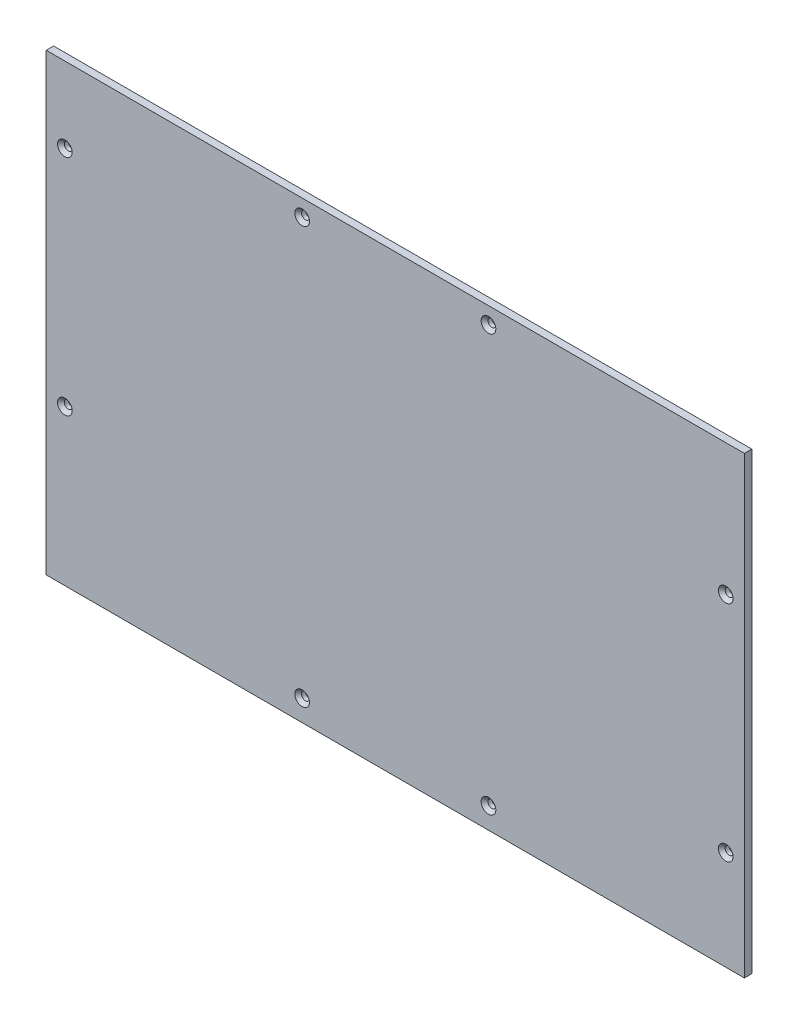
ISO-10303-21;
HEADER;
FILE_DESCRIPTION(('STEP AP214'),'2;1');
FILE_NAME('part.step','',(''),(''),'','','');
FILE_SCHEMA(('AUTOMOTIVE_DESIGN { 1 0 10303 214 1 1 1 1 }'));
ENDSEC;
DATA;
#1=APPLICATION_CONTEXT('core data for automotive mechanical design processes');
#2=APPLICATION_PROTOCOL_DEFINITION('international standard','automotive_design',2000,#1);
#3=PRODUCT_CONTEXT('',#1,'mechanical');
#4=PRODUCT('Part','Part','',(#3));
#5=PRODUCT_RELATED_PRODUCT_CATEGORY('part','',(#4));
#6=PRODUCT_DEFINITION_FORMATION('','',#4);
#7=PRODUCT_DEFINITION_CONTEXT('part definition',#1,'design');
#8=PRODUCT_DEFINITION('design','',#6,#7);
#9=PRODUCT_DEFINITION_SHAPE('','',#8);
#10=(LENGTH_UNIT() NAMED_UNIT(*) SI_UNIT(.MILLI.,.METRE.));
#11=(NAMED_UNIT(*) PLANE_ANGLE_UNIT() SI_UNIT($,.RADIAN.));
#12=(NAMED_UNIT(*) SI_UNIT($,.STERADIAN.) SOLID_ANGLE_UNIT());
#13=UNCERTAINTY_MEASURE_WITH_UNIT(LENGTH_MEASURE(1.E-05),#10,'distance_accuracy_value','');
#14=(GEOMETRIC_REPRESENTATION_CONTEXT(3) GLOBAL_UNCERTAINTY_ASSIGNED_CONTEXT((#13)) GLOBAL_UNIT_ASSIGNED_CONTEXT((#10,
#11,#12)) REPRESENTATION_CONTEXT('',''));
#15=CARTESIAN_POINT('',(0.,0.,0.));
#16=DIRECTION('',(0.,0.,1.));
#17=DIRECTION('',(1.,0.,0.));
#18=AXIS2_PLACEMENT_3D('',#15,#16,#17);
#19=CARTESIAN_POINT('',(-149.85,0.,3.175));
#20=DIRECTION('',(1.,0.,0.));
#21=DIRECTION('',(0.,1.,0.));
#22=AXIS2_PLACEMENT_3D('',#19,#20,#21);
#23=PLANE('',#22);
#24=DIRECTION('',(0.,-1.,0.));
#25=VECTOR('',#24,1.);
#26=CARTESIAN_POINT('',(-149.85,0.,0.));
#27=LINE('',#26,#25);
#28=CARTESIAN_POINT('',(-149.85,97.521875,0.));
#29=VERTEX_POINT('',#28);
#30=CARTESIAN_POINT('',(-149.85,-97.521875,0.));
#31=VERTEX_POINT('',#30);
#32=EDGE_CURVE('E106',#29,#31,#27,.T.);
#33=ORIENTED_EDGE('',*,*,#32,.T.);
#34=DIRECTION('',(0.,0.,-1.));
#35=VECTOR('',#34,1.);
#36=CARTESIAN_POINT('',(-149.85,-97.521875,3.175));
#37=LINE('',#36,#35);
#38=CARTESIAN_POINT('',(-149.85,-97.521875,3.175));
#39=VERTEX_POINT('',#38);
#40=EDGE_CURVE('E11',#39,#31,#37,.T.);
#41=ORIENTED_EDGE('',*,*,#40,.F.);
#42=DIRECTION('',(0.,-1.,0.));
#43=VECTOR('',#42,1.);
#44=CARTESIAN_POINT('',(-149.85,0.,3.175));
#45=LINE('',#44,#43);
#46=CARTESIAN_POINT('',(-149.85,97.521875,3.175));
#47=VERTEX_POINT('',#46);
#48=EDGE_CURVE('E92',#47,#39,#45,.T.);
#49=ORIENTED_EDGE('',*,*,#48,.F.);
#50=DIRECTION('',(0.,0.,-1.));
#51=VECTOR('',#50,1.);
#52=CARTESIAN_POINT('',(-149.85,97.521875,3.175));
#53=LINE('',#52,#51);
#54=EDGE_CURVE('E59',#47,#29,#53,.T.);
#55=ORIENTED_EDGE('',*,*,#54,.T.);
#56=EDGE_LOOP('',(#33,#41,#49,#55));
#57=FACE_BOUND('',#56,.T.);
#58=ADVANCED_FACE('F43',(#57),#23,.F.);
#59=CARTESIAN_POINT('',(0.,-97.521875,3.175));
#60=DIRECTION('',(0.,1.,0.));
#61=DIRECTION('',(0.,0.,1.));
#62=AXIS2_PLACEMENT_3D('',#59,#60,#61);
#63=PLANE('',#62);
#64=DIRECTION('',(1.,0.,0.));
#65=VECTOR('',#64,1.);
#66=CARTESIAN_POINT('',(0.,-97.521875,0.));
#67=LINE('',#66,#65);
#68=CARTESIAN_POINT('',(149.85,-97.521875,0.));
#69=VERTEX_POINT('',#68);
#70=EDGE_CURVE('E97',#31,#69,#67,.T.);
#71=ORIENTED_EDGE('',*,*,#70,.T.);
#72=DIRECTION('',(0.,0.,-1.));
#73=VECTOR('',#72,1.);
#74=CARTESIAN_POINT('',(149.85,-97.521875,3.175));
#75=LINE('',#74,#73);
#76=CARTESIAN_POINT('',(149.85,-97.521875,3.175));
#77=VERTEX_POINT('',#76);
#78=EDGE_CURVE('E51',#77,#69,#75,.T.);
#79=ORIENTED_EDGE('',*,*,#78,.F.);
#80=DIRECTION('',(1.,0.,0.));
#81=VECTOR('',#80,1.);
#82=CARTESIAN_POINT('',(0.,-97.521875,3.175));
#83=LINE('',#82,#81);
#84=EDGE_CURVE('E84',#39,#77,#83,.T.);
#85=ORIENTED_EDGE('',*,*,#84,.F.);
#86=ORIENTED_EDGE('',*,*,#40,.T.);
#87=EDGE_LOOP('',(#71,#79,#85,#86));
#88=FACE_BOUND('',#87,.T.);
#89=ADVANCED_FACE('F96',(#88),#63,.F.);
#90=CARTESIAN_POINT('',(149.85,0.,3.175));
#91=DIRECTION('',(1.,0.,0.));
#92=DIRECTION('',(0.,1.,0.));
#93=AXIS2_PLACEMENT_3D('',#90,#91,#92);
#94=PLANE('',#93);
#95=DIRECTION('',(0.,-1.,0.));
#96=VECTOR('',#95,1.);
#97=CARTESIAN_POINT('',(149.85,0.,0.));
#98=LINE('',#97,#96);
#99=CARTESIAN_POINT('',(149.85,97.521875,0.));
#100=VERTEX_POINT('',#99);
#101=EDGE_CURVE('E110',#100,#69,#98,.T.);
#102=ORIENTED_EDGE('',*,*,#101,.F.);
#103=DIRECTION('',(0.,0.,-1.));
#104=VECTOR('',#103,1.);
#105=CARTESIAN_POINT('',(149.85,97.521875,3.175));
#106=LINE('',#105,#104);
#107=CARTESIAN_POINT('',(149.85,97.521875,3.175));
#108=VERTEX_POINT('',#107);
#109=EDGE_CURVE('E73',#108,#100,#106,.T.);
#110=ORIENTED_EDGE('',*,*,#109,.F.);
#111=DIRECTION('',(0.,-1.,0.));
#112=VECTOR('',#111,1.);
#113=CARTESIAN_POINT('',(149.85,0.,3.175));
#114=LINE('',#113,#112);
#115=EDGE_CURVE('E91',#108,#77,#114,.T.);
#116=ORIENTED_EDGE('',*,*,#115,.T.);
#117=ORIENTED_EDGE('',*,*,#78,.T.);
#118=EDGE_LOOP('',(#102,#110,#116,#117));
#119=FACE_BOUND('',#118,.T.);
#120=ADVANCED_FACE('F100',(#119),#94,.T.);
#121=CARTESIAN_POINT('',(0.,97.521875,3.175));
#122=DIRECTION('',(0.,1.,0.));
#123=DIRECTION('',(0.,0.,1.));
#124=AXIS2_PLACEMENT_3D('',#121,#122,#123);
#125=PLANE('',#124);
#126=DIRECTION('',(1.,0.,0.));
#127=VECTOR('',#126,1.);
#128=CARTESIAN_POINT('',(0.,97.521875,0.));
#129=LINE('',#128,#127);
#130=EDGE_CURVE('E112',#29,#100,#129,.T.);
#131=ORIENTED_EDGE('',*,*,#130,.F.);
#132=ORIENTED_EDGE('',*,*,#54,.F.);
#133=DIRECTION('',(1.,0.,0.));
#134=VECTOR('',#133,1.);
#135=CARTESIAN_POINT('',(0.,97.521875,3.175));
#136=LINE('',#135,#134);
#137=EDGE_CURVE('E101',#47,#108,#136,.T.);
#138=ORIENTED_EDGE('',*,*,#137,.T.);
#139=ORIENTED_EDGE('',*,*,#109,.T.);
#140=EDGE_LOOP('',(#131,#132,#138,#139));
#141=FACE_BOUND('',#140,.T.);
#142=ADVANCED_FACE('F195',(#141),#125,.T.);
#143=CARTESIAN_POINT('',(0.,0.,3.175));
#144=DIRECTION('',(0.,0.,1.));
#145=DIRECTION('',(1.,0.,0.));
#146=AXIS2_PLACEMENT_3D('',#143,#144,#145);
#147=PLANE('',#146);
#148=CARTESIAN_POINT('',(-40.0000000000012,90.3781250520014,3.175));
#149=DIRECTION('',(0.,0.,1.));
#150=DIRECTION('',(1.,0.,0.));
#151=AXIS2_PLACEMENT_3D('',#148,#149,#150);
#152=CIRCLE('',#151,3.15);
#153=CARTESIAN_POINT('',(-36.8500000000012,90.3781250520014,3.175));
#154=VERTEX_POINT('',#153);
#155=EDGE_CURVE('E186',#154,#154,#152,.T.);
#156=ORIENTED_EDGE('',*,*,#155,.F.);
#157=EDGE_LOOP('',(#156));
#158=FACE_BOUND('',#157,.T.);
#159=CARTESIAN_POINT('',(40.0000000000012,90.3781250520013,3.175));
#160=DIRECTION('',(0.,0.,1.));
#161=DIRECTION('',(1.,0.,0.));
#162=AXIS2_PLACEMENT_3D('',#159,#160,#161);
#163=CIRCLE('',#162,3.15);
#164=CARTESIAN_POINT('',(43.1500000000012,90.3781250520013,3.175));
#165=VERTEX_POINT('',#164);
#166=EDGE_CURVE('E177',#165,#165,#163,.T.);
#167=ORIENTED_EDGE('',*,*,#166,.F.);
#168=EDGE_LOOP('',(#167));
#169=FACE_BOUND('',#168,.T.);
#170=CARTESIAN_POINT('',(141.850000066001,41.078125052,3.175));
#171=DIRECTION('',(0.,0.,1.));
#172=DIRECTION('',(1.,0.,0.));
#173=AXIS2_PLACEMENT_3D('',#170,#171,#172);
#174=CIRCLE('',#173,3.15000000000001);
#175=CARTESIAN_POINT('',(145.000000066001,41.078125052,3.175));
#176=VERTEX_POINT('',#175);
#177=EDGE_CURVE('E168',#176,#176,#174,.T.);
#178=ORIENTED_EDGE('',*,*,#177,.F.);
#179=EDGE_LOOP('',(#178));
#180=FACE_BOUND('',#179,.T.);
#181=CARTESIAN_POINT('',(141.850000066,-54.921874948,3.175));
#182=DIRECTION('',(0.,0.,1.));
#183=DIRECTION('',(1.,0.,0.));
#184=AXIS2_PLACEMENT_3D('',#181,#182,#183);
#185=CIRCLE('',#184,3.15000000000001);
#186=CARTESIAN_POINT('',(145.000000066,-54.921874948,3.175));
#187=VERTEX_POINT('',#186);
#188=EDGE_CURVE('E159',#187,#187,#185,.T.);
#189=ORIENTED_EDGE('',*,*,#188,.F.);
#190=EDGE_LOOP('',(#189));
#191=FACE_BOUND('',#190,.T.);
#192=CARTESIAN_POINT('',(40.0000000000011,-88.4276249479999,3.175));
#193=DIRECTION('',(0.,0.,1.));
#194=DIRECTION('',(1.,0.,0.));
#195=AXIS2_PLACEMENT_3D('',#192,#193,#194);
#196=CIRCLE('',#195,3.15);
#197=CARTESIAN_POINT('',(43.1500000000011,-88.4276249479999,3.175));
#198=VERTEX_POINT('',#197);
#199=EDGE_CURVE('E150',#198,#198,#196,.T.);
#200=ORIENTED_EDGE('',*,*,#199,.F.);
#201=EDGE_LOOP('',(#200));
#202=FACE_BOUND('',#201,.T.);
#203=CARTESIAN_POINT('',(-40.0000000000013,-88.4276249479999,3.175));
#204=DIRECTION('',(0.,0.,1.));
#205=DIRECTION('',(1.,0.,0.));
#206=AXIS2_PLACEMENT_3D('',#203,#204,#205);
#207=CIRCLE('',#206,3.15);
#208=CARTESIAN_POINT('',(-36.8500000000013,-88.4276249479999,3.175));
#209=VERTEX_POINT('',#208);
#210=EDGE_CURVE('E141',#209,#209,#207,.T.);
#211=ORIENTED_EDGE('',*,*,#210,.F.);
#212=EDGE_LOOP('',(#211));
#213=FACE_BOUND('',#212,.T.);
#214=CARTESIAN_POINT('',(-141.850000066,-30.9218749479998,3.175));
#215=DIRECTION('',(0.,0.,1.));
#216=DIRECTION('',(1.,0.,0.));
#217=AXIS2_PLACEMENT_3D('',#214,#215,#216);
#218=CIRCLE('',#217,3.14999999999999);
#219=CARTESIAN_POINT('',(-138.700000066,-30.9218749479998,3.175));
#220=VERTEX_POINT('',#219);
#221=EDGE_CURVE('E132',#220,#220,#218,.T.);
#222=ORIENTED_EDGE('',*,*,#221,.F.);
#223=EDGE_LOOP('',(#222));
#224=FACE_BOUND('',#223,.T.);
#225=CARTESIAN_POINT('',(-141.850000066,65.0781250520002,3.175));
#226=DIRECTION('',(0.,0.,1.));
#227=DIRECTION('',(1.,0.,0.));
#228=AXIS2_PLACEMENT_3D('',#225,#226,#227);
#229=CIRCLE('',#228,3.14999999999999);
#230=CARTESIAN_POINT('',(-138.700000066,65.0781250520002,3.175));
#231=VERTEX_POINT('',#230);
#232=EDGE_CURVE('E123',#231,#231,#229,.T.);
#233=ORIENTED_EDGE('',*,*,#232,.F.);
#234=EDGE_LOOP('',(#233));
#235=FACE_BOUND('',#234,.T.);
#236=ORIENTED_EDGE('',*,*,#48,.T.);
#237=ORIENTED_EDGE('',*,*,#84,.T.);
#238=ORIENTED_EDGE('',*,*,#115,.F.);
#239=ORIENTED_EDGE('',*,*,#137,.F.);
#240=EDGE_LOOP('',(#236,#237,#238,#239));
#241=FACE_BOUND('',#240,.T.);
#242=ADVANCED_FACE('F88',(#158,#169,#180,#191,#202,#213,#224,#235,#241),#147,.T.);
#243=CARTESIAN_POINT('',(0.,0.,0.));
#244=DIRECTION('',(0.,0.,1.));
#245=DIRECTION('',(1.,0.,0.));
#246=AXIS2_PLACEMENT_3D('',#243,#244,#245);
#247=PLANE('',#246);
#248=CARTESIAN_POINT('',(-40.0000000000012,90.3781250520014,0.));
#249=DIRECTION('',(0.,0.,1.));
#250=DIRECTION('',(1.,0.,0.));
#251=AXIS2_PLACEMENT_3D('',#248,#249,#250);
#252=CIRCLE('',#251,1.69999999999999);
#253=CARTESIAN_POINT('',(-38.3000000000012,90.3781250520014,0.));
#254=VERTEX_POINT('',#253);
#255=EDGE_CURVE('E180',#254,#254,#252,.T.);
#256=ORIENTED_EDGE('',*,*,#255,.T.);
#257=EDGE_LOOP('',(#256));
#258=FACE_BOUND('',#257,.T.);
#259=CARTESIAN_POINT('',(40.0000000000012,90.3781250520013,0.));
#260=DIRECTION('',(0.,0.,1.));
#261=DIRECTION('',(1.,0.,0.));
#262=AXIS2_PLACEMENT_3D('',#259,#260,#261);
#263=CIRCLE('',#262,1.69999999999999);
#264=CARTESIAN_POINT('',(41.7000000000012,90.3781250520013,0.));
#265=VERTEX_POINT('',#264);
#266=EDGE_CURVE('E171',#265,#265,#263,.T.);
#267=ORIENTED_EDGE('',*,*,#266,.T.);
#268=EDGE_LOOP('',(#267));
#269=FACE_BOUND('',#268,.T.);
#270=CARTESIAN_POINT('',(141.850000066001,41.078125052,0.));
#271=DIRECTION('',(0.,0.,1.));
#272=DIRECTION('',(1.,0.,0.));
#273=AXIS2_PLACEMENT_3D('',#270,#271,#272);
#274=CIRCLE('',#273,1.69999999999998);
#275=CARTESIAN_POINT('',(143.550000066001,41.078125052,0.));
#276=VERTEX_POINT('',#275);
#277=EDGE_CURVE('E162',#276,#276,#274,.T.);
#278=ORIENTED_EDGE('',*,*,#277,.T.);
#279=EDGE_LOOP('',(#278));
#280=FACE_BOUND('',#279,.T.);
#281=CARTESIAN_POINT('',(141.850000066,-54.921874948,0.));
#282=DIRECTION('',(0.,0.,1.));
#283=DIRECTION('',(1.,0.,0.));
#284=AXIS2_PLACEMENT_3D('',#281,#282,#283);
#285=CIRCLE('',#284,1.69999999999998);
#286=CARTESIAN_POINT('',(143.550000066,-54.921874948,0.));
#287=VERTEX_POINT('',#286);
#288=EDGE_CURVE('E153',#287,#287,#285,.T.);
#289=ORIENTED_EDGE('',*,*,#288,.T.);
#290=EDGE_LOOP('',(#289));
#291=FACE_BOUND('',#290,.T.);
#292=CARTESIAN_POINT('',(40.0000000000011,-88.4276249479999,0.));
#293=DIRECTION('',(0.,0.,1.));
#294=DIRECTION('',(1.,0.,0.));
#295=AXIS2_PLACEMENT_3D('',#292,#293,#294);
#296=CIRCLE('',#295,1.69999999999999);
#297=CARTESIAN_POINT('',(41.7000000000011,-88.4276249479999,0.));
#298=VERTEX_POINT('',#297);
#299=EDGE_CURVE('E144',#298,#298,#296,.T.);
#300=ORIENTED_EDGE('',*,*,#299,.T.);
#301=EDGE_LOOP('',(#300));
#302=FACE_BOUND('',#301,.T.);
#303=CARTESIAN_POINT('',(-40.0000000000013,-88.4276249479999,0.));
#304=DIRECTION('',(0.,0.,1.));
#305=DIRECTION('',(1.,0.,0.));
#306=AXIS2_PLACEMENT_3D('',#303,#304,#305);
#307=CIRCLE('',#306,1.69999999999999);
#308=CARTESIAN_POINT('',(-38.3000000000013,-88.4276249479999,0.));
#309=VERTEX_POINT('',#308);
#310=EDGE_CURVE('E135',#309,#309,#307,.T.);
#311=ORIENTED_EDGE('',*,*,#310,.T.);
#312=EDGE_LOOP('',(#311));
#313=FACE_BOUND('',#312,.T.);
#314=CARTESIAN_POINT('',(-141.850000066,-30.9218749479998,0.));
#315=DIRECTION('',(0.,0.,1.));
#316=DIRECTION('',(1.,0.,0.));
#317=AXIS2_PLACEMENT_3D('',#314,#315,#316);
#318=CIRCLE('',#317,1.69999999999998);
#319=CARTESIAN_POINT('',(-140.150000066,-30.9218749479998,0.));
#320=VERTEX_POINT('',#319);
#321=EDGE_CURVE('E126',#320,#320,#318,.T.);
#322=ORIENTED_EDGE('',*,*,#321,.T.);
#323=EDGE_LOOP('',(#322));
#324=FACE_BOUND('',#323,.T.);
#325=CARTESIAN_POINT('',(-141.850000066,65.0781250520002,0.));
#326=DIRECTION('',(0.,0.,1.));
#327=DIRECTION('',(1.,0.,0.));
#328=AXIS2_PLACEMENT_3D('',#325,#326,#327);
#329=CIRCLE('',#328,1.69999999999998);
#330=CARTESIAN_POINT('',(-140.150000066,65.0781250520002,0.));
#331=VERTEX_POINT('',#330);
#332=EDGE_CURVE('E108',#331,#331,#329,.T.);
#333=ORIENTED_EDGE('',*,*,#332,.T.);
#334=EDGE_LOOP('',(#333));
#335=FACE_BOUND('',#334,.T.);
#336=ORIENTED_EDGE('',*,*,#32,.F.);
#337=ORIENTED_EDGE('',*,*,#130,.T.);
#338=ORIENTED_EDGE('',*,*,#101,.T.);
#339=ORIENTED_EDGE('',*,*,#70,.F.);
#340=EDGE_LOOP('',(#336,#337,#338,#339));
#341=FACE_BOUND('',#340,.T.);
#342=ADVANCED_FACE('F194',(#258,#269,#280,#291,#302,#313,#324,#335,#341),#247,.F.);
#343=CARTESIAN_POINT('',(-141.850000066,65.0781250520002,3.175));
#344=DIRECTION('',(0.,0.,1.));
#345=DIRECTION('',(1.,0.,0.));
#346=AXIS2_PLACEMENT_3D('',#343,#344,#345);
#347=CYLINDRICAL_SURFACE('',#346,1.69999999999998);
#348=ORIENTED_EDGE('',*,*,#332,.F.);
#349=EDGE_LOOP('',(#348));
#350=FACE_BOUND('',#349,.T.);
#351=CARTESIAN_POINT('',(-141.850000066,65.0781250520002,1.72499999999999));
#352=DIRECTION('',(0.,0.,1.));
#353=DIRECTION('',(1.,0.,0.));
#354=AXIS2_PLACEMENT_3D('',#351,#352,#353);
#355=CIRCLE('',#354,1.69999999999998);
#356=CARTESIAN_POINT('',(-140.150000066,65.0781250520002,1.72499999999999));
#357=VERTEX_POINT('',#356);
#358=EDGE_CURVE('E120',#357,#357,#355,.T.);
#359=ORIENTED_EDGE('',*,*,#358,.T.);
#360=EDGE_LOOP('',(#359));
#361=FACE_BOUND('',#360,.T.);
#362=ADVANCED_FACE('F214',(#350,#361),#347,.F.);
#363=CARTESIAN_POINT('',(-141.850000066,65.0781250520002,3.175));
#364=DIRECTION('',(0.,0.,1.));
#365=DIRECTION('',(1.,0.,0.));
#366=AXIS2_PLACEMENT_3D('',#363,#364,#365);
#367=CONICAL_SURFACE('',#366,3.14999999999999,0.785398163397448);
#368=ORIENTED_EDGE('',*,*,#358,.F.);
#369=EDGE_LOOP('',(#368));
#370=FACE_BOUND('',#369,.T.);
#371=ORIENTED_EDGE('',*,*,#232,.T.);
#372=EDGE_LOOP('',(#371));
#373=FACE_BOUND('',#372,.T.);
#374=ADVANCED_FACE('F211',(#370,#373),#367,.F.);
#375=CARTESIAN_POINT('',(-141.850000066,-30.9218749479998,3.175));
#376=DIRECTION('',(0.,0.,1.));
#377=DIRECTION('',(1.,0.,0.));
#378=AXIS2_PLACEMENT_3D('',#375,#376,#377);
#379=CYLINDRICAL_SURFACE('',#378,1.69999999999998);
#380=ORIENTED_EDGE('',*,*,#321,.F.);
#381=EDGE_LOOP('',(#380));
#382=FACE_BOUND('',#381,.T.);
#383=CARTESIAN_POINT('',(-141.850000066,-30.9218749479998,1.72499999999999));
#384=DIRECTION('',(0.,0.,1.));
#385=DIRECTION('',(1.,0.,0.));
#386=AXIS2_PLACEMENT_3D('',#383,#384,#385);
#387=CIRCLE('',#386,1.69999999999998);
#388=CARTESIAN_POINT('',(-140.150000066,-30.9218749479998,1.72499999999999));
#389=VERTEX_POINT('',#388);
#390=EDGE_CURVE('E129',#389,#389,#387,.T.);
#391=ORIENTED_EDGE('',*,*,#390,.T.);
#392=EDGE_LOOP('',(#391));
#393=FACE_BOUND('',#392,.T.);
#394=ADVANCED_FACE('F213',(#382,#393),#379,.F.);
#395=CARTESIAN_POINT('',(-141.850000066,-30.9218749479998,3.175));
#396=DIRECTION('',(0.,0.,1.));
#397=DIRECTION('',(1.,0.,0.));
#398=AXIS2_PLACEMENT_3D('',#395,#396,#397);
#399=CONICAL_SURFACE('',#398,3.14999999999999,0.785398163397448);
#400=ORIENTED_EDGE('',*,*,#390,.F.);
#401=EDGE_LOOP('',(#400));
#402=FACE_BOUND('',#401,.T.);
#403=ORIENTED_EDGE('',*,*,#221,.T.);
#404=EDGE_LOOP('',(#403));
#405=FACE_BOUND('',#404,.T.);
#406=ADVANCED_FACE('F221',(#402,#405),#399,.F.);
#407=CARTESIAN_POINT('',(-40.0000000000013,-88.4276249479999,3.175));
#408=DIRECTION('',(0.,0.,1.));
#409=DIRECTION('',(1.,0.,0.));
#410=AXIS2_PLACEMENT_3D('',#407,#408,#409);
#411=CYLINDRICAL_SURFACE('',#410,1.69999999999999);
#412=ORIENTED_EDGE('',*,*,#310,.F.);
#413=EDGE_LOOP('',(#412));
#414=FACE_BOUND('',#413,.T.);
#415=CARTESIAN_POINT('',(-40.0000000000013,-88.4276249479999,1.72499999999999));
#416=DIRECTION('',(0.,0.,1.));
#417=DIRECTION('',(1.,0.,0.));
#418=AXIS2_PLACEMENT_3D('',#415,#416,#417);
#419=CIRCLE('',#418,1.69999999999999);
#420=CARTESIAN_POINT('',(-38.3000000000013,-88.4276249479999,1.72499999999999));
#421=VERTEX_POINT('',#420);
#422=EDGE_CURVE('E138',#421,#421,#419,.T.);
#423=ORIENTED_EDGE('',*,*,#422,.T.);
#424=EDGE_LOOP('',(#423));
#425=FACE_BOUND('',#424,.T.);
#426=ADVANCED_FACE('F263',(#414,#425),#411,.F.);
#427=CARTESIAN_POINT('',(-40.0000000000013,-88.4276249479999,3.175));
#428=DIRECTION('',(0.,0.,1.));
#429=DIRECTION('',(1.,0.,0.));
#430=AXIS2_PLACEMENT_3D('',#427,#428,#429);
#431=CONICAL_SURFACE('',#430,3.15,0.78539816339745);
#432=ORIENTED_EDGE('',*,*,#422,.F.);
#433=EDGE_LOOP('',(#432));
#434=FACE_BOUND('',#433,.T.);
#435=ORIENTED_EDGE('',*,*,#210,.T.);
#436=EDGE_LOOP('',(#435));
#437=FACE_BOUND('',#436,.T.);
#438=ADVANCED_FACE('F268',(#434,#437),#431,.F.);
#439=CARTESIAN_POINT('',(40.0000000000011,-88.4276249479999,3.175));
#440=DIRECTION('',(0.,0.,1.));
#441=DIRECTION('',(1.,0.,0.));
#442=AXIS2_PLACEMENT_3D('',#439,#440,#441);
#443=CYLINDRICAL_SURFACE('',#442,1.69999999999999);
#444=ORIENTED_EDGE('',*,*,#299,.F.);
#445=EDGE_LOOP('',(#444));
#446=FACE_BOUND('',#445,.T.);
#447=CARTESIAN_POINT('',(40.0000000000011,-88.4276249479999,1.72499999999999));
#448=DIRECTION('',(0.,0.,1.));
#449=DIRECTION('',(1.,0.,0.));
#450=AXIS2_PLACEMENT_3D('',#447,#448,#449);
#451=CIRCLE('',#450,1.69999999999999);
#452=CARTESIAN_POINT('',(41.7000000000011,-88.4276249479999,1.72499999999999));
#453=VERTEX_POINT('',#452);
#454=EDGE_CURVE('E147',#453,#453,#451,.T.);
#455=ORIENTED_EDGE('',*,*,#454,.T.);
#456=EDGE_LOOP('',(#455));
#457=FACE_BOUND('',#456,.T.);
#458=ADVANCED_FACE('F274',(#446,#457),#443,.F.);
#459=CARTESIAN_POINT('',(40.0000000000011,-88.4276249479999,3.175));
#460=DIRECTION('',(0.,0.,1.));
#461=DIRECTION('',(1.,0.,0.));
#462=AXIS2_PLACEMENT_3D('',#459,#460,#461);
#463=CONICAL_SURFACE('',#462,3.15,0.78539816339745);
#464=ORIENTED_EDGE('',*,*,#454,.F.);
#465=EDGE_LOOP('',(#464));
#466=FACE_BOUND('',#465,.T.);
#467=ORIENTED_EDGE('',*,*,#199,.T.);
#468=EDGE_LOOP('',(#467));
#469=FACE_BOUND('',#468,.T.);
#470=ADVANCED_FACE('F278',(#466,#469),#463,.F.);
#471=CARTESIAN_POINT('',(141.850000066,-54.921874948,3.175));
#472=DIRECTION('',(0.,0.,1.));
#473=DIRECTION('',(1.,0.,0.));
#474=AXIS2_PLACEMENT_3D('',#471,#472,#473);
#475=CYLINDRICAL_SURFACE('',#474,1.69999999999998);
#476=ORIENTED_EDGE('',*,*,#288,.F.);
#477=EDGE_LOOP('',(#476));
#478=FACE_BOUND('',#477,.T.);
#479=CARTESIAN_POINT('',(141.850000066,-54.921874948,1.72499999999999));
#480=DIRECTION('',(0.,0.,1.));
#481=DIRECTION('',(1.,0.,0.));
#482=AXIS2_PLACEMENT_3D('',#479,#480,#481);
#483=CIRCLE('',#482,1.69999999999998);
#484=CARTESIAN_POINT('',(143.550000066,-54.921874948,1.72499999999999));
#485=VERTEX_POINT('',#484);
#486=EDGE_CURVE('E156',#485,#485,#483,.T.);
#487=ORIENTED_EDGE('',*,*,#486,.T.);
#488=EDGE_LOOP('',(#487));
#489=FACE_BOUND('',#488,.T.);
#490=ADVANCED_FACE('F282',(#478,#489),#475,.F.);
#491=CARTESIAN_POINT('',(141.850000066,-54.921874948,3.175));
#492=DIRECTION('',(0.,0.,1.));
#493=DIRECTION('',(1.,0.,0.));
#494=AXIS2_PLACEMENT_3D('',#491,#492,#493);
#495=CONICAL_SURFACE('',#494,3.15000000000001,0.785398163397457);
#496=ORIENTED_EDGE('',*,*,#486,.F.);
#497=EDGE_LOOP('',(#496));
#498=FACE_BOUND('',#497,.T.);
#499=ORIENTED_EDGE('',*,*,#188,.T.);
#500=EDGE_LOOP('',(#499));
#501=FACE_BOUND('',#500,.T.);
#502=ADVANCED_FACE('F286',(#498,#501),#495,.F.);
#503=CARTESIAN_POINT('',(141.850000066001,41.078125052,3.175));
#504=DIRECTION('',(0.,0.,1.));
#505=DIRECTION('',(1.,0.,0.));
#506=AXIS2_PLACEMENT_3D('',#503,#504,#505);
#507=CYLINDRICAL_SURFACE('',#506,1.69999999999998);
#508=ORIENTED_EDGE('',*,*,#277,.F.);
#509=EDGE_LOOP('',(#508));
#510=FACE_BOUND('',#509,.T.);
#511=CARTESIAN_POINT('',(141.850000066001,41.078125052,1.72499999999999));
#512=DIRECTION('',(0.,0.,1.));
#513=DIRECTION('',(1.,0.,0.));
#514=AXIS2_PLACEMENT_3D('',#511,#512,#513);
#515=CIRCLE('',#514,1.69999999999998);
#516=CARTESIAN_POINT('',(143.550000066001,41.078125052,1.72499999999999));
#517=VERTEX_POINT('',#516);
#518=EDGE_CURVE('E165',#517,#517,#515,.T.);
#519=ORIENTED_EDGE('',*,*,#518,.T.);
#520=EDGE_LOOP('',(#519));
#521=FACE_BOUND('',#520,.T.);
#522=ADVANCED_FACE('F290',(#510,#521),#507,.F.);
#523=CARTESIAN_POINT('',(141.850000066001,41.078125052,3.175));
#524=DIRECTION('',(0.,0.,1.));
#525=DIRECTION('',(1.,0.,0.));
#526=AXIS2_PLACEMENT_3D('',#523,#524,#525);
#527=CONICAL_SURFACE('',#526,3.15000000000001,0.785398163397457);
#528=ORIENTED_EDGE('',*,*,#518,.F.);
#529=EDGE_LOOP('',(#528));
#530=FACE_BOUND('',#529,.T.);
#531=ORIENTED_EDGE('',*,*,#177,.T.);
#532=EDGE_LOOP('',(#531));
#533=FACE_BOUND('',#532,.T.);
#534=ADVANCED_FACE('F294',(#530,#533),#527,.F.);
#535=CARTESIAN_POINT('',(40.0000000000012,90.3781250520013,3.175));
#536=DIRECTION('',(0.,0.,1.));
#537=DIRECTION('',(1.,0.,0.));
#538=AXIS2_PLACEMENT_3D('',#535,#536,#537);
#539=CYLINDRICAL_SURFACE('',#538,1.69999999999999);
#540=ORIENTED_EDGE('',*,*,#266,.F.);
#541=EDGE_LOOP('',(#540));
#542=FACE_BOUND('',#541,.T.);
#543=CARTESIAN_POINT('',(40.0000000000012,90.3781250520013,1.72499999999999));
#544=DIRECTION('',(0.,0.,1.));
#545=DIRECTION('',(1.,0.,0.));
#546=AXIS2_PLACEMENT_3D('',#543,#544,#545);
#547=CIRCLE('',#546,1.69999999999999);
#548=CARTESIAN_POINT('',(41.7000000000012,90.3781250520013,1.72499999999999));
#549=VERTEX_POINT('',#548);
#550=EDGE_CURVE('E174',#549,#549,#547,.T.);
#551=ORIENTED_EDGE('',*,*,#550,.T.);
#552=EDGE_LOOP('',(#551));
#553=FACE_BOUND('',#552,.T.);
#554=ADVANCED_FACE('F298',(#542,#553),#539,.F.);
#555=CARTESIAN_POINT('',(40.0000000000012,90.3781250520013,3.175));
#556=DIRECTION('',(0.,0.,1.));
#557=DIRECTION('',(1.,0.,0.));
#558=AXIS2_PLACEMENT_3D('',#555,#556,#557);
#559=CONICAL_SURFACE('',#558,3.15,0.78539816339745);
#560=ORIENTED_EDGE('',*,*,#550,.F.);
#561=EDGE_LOOP('',(#560));
#562=FACE_BOUND('',#561,.T.);
#563=ORIENTED_EDGE('',*,*,#166,.T.);
#564=EDGE_LOOP('',(#563));
#565=FACE_BOUND('',#564,.T.);
#566=ADVANCED_FACE('F302',(#562,#565),#559,.F.);
#567=CARTESIAN_POINT('',(-40.0000000000012,90.3781250520014,3.175));
#568=DIRECTION('',(0.,0.,1.));
#569=DIRECTION('',(1.,0.,0.));
#570=AXIS2_PLACEMENT_3D('',#567,#568,#569);
#571=CYLINDRICAL_SURFACE('',#570,1.69999999999999);
#572=ORIENTED_EDGE('',*,*,#255,.F.);
#573=EDGE_LOOP('',(#572));
#574=FACE_BOUND('',#573,.T.);
#575=CARTESIAN_POINT('',(-40.0000000000012,90.3781250520014,1.72499999999999));
#576=DIRECTION('',(0.,0.,1.));
#577=DIRECTION('',(1.,0.,0.));
#578=AXIS2_PLACEMENT_3D('',#575,#576,#577);
#579=CIRCLE('',#578,1.69999999999999);
#580=CARTESIAN_POINT('',(-38.3000000000012,90.3781250520014,1.72499999999999));
#581=VERTEX_POINT('',#580);
#582=EDGE_CURVE('E183',#581,#581,#579,.T.);
#583=ORIENTED_EDGE('',*,*,#582,.T.);
#584=EDGE_LOOP('',(#583));
#585=FACE_BOUND('',#584,.T.);
#586=ADVANCED_FACE('F306',(#574,#585),#571,.F.);
#587=CARTESIAN_POINT('',(-40.0000000000012,90.3781250520014,3.175));
#588=DIRECTION('',(0.,0.,1.));
#589=DIRECTION('',(1.,0.,0.));
#590=AXIS2_PLACEMENT_3D('',#587,#588,#589);
#591=CONICAL_SURFACE('',#590,3.15,0.78539816339745);
#592=ORIENTED_EDGE('',*,*,#582,.F.);
#593=EDGE_LOOP('',(#592));
#594=FACE_BOUND('',#593,.T.);
#595=ORIENTED_EDGE('',*,*,#155,.T.);
#596=EDGE_LOOP('',(#595));
#597=FACE_BOUND('',#596,.T.);
#598=ADVANCED_FACE('F190',(#594,#597),#591,.F.);
#599=CLOSED_SHELL('',(#58,#89,#120,#142,#242,#342,#362,#374,#394,#406,#426,#438,#458,#470,#490,
#502,#522,#534,#554,#566,#586,#598));
#600=MANIFOLD_SOLID_BREP('B2',#599);
#601=ADVANCED_BREP_SHAPE_REPRESENTATION('',(#18,#600),#14);
#602=SHAPE_DEFINITION_REPRESENTATION(#9,#601);
ENDSEC;
END-ISO-10303-21;
